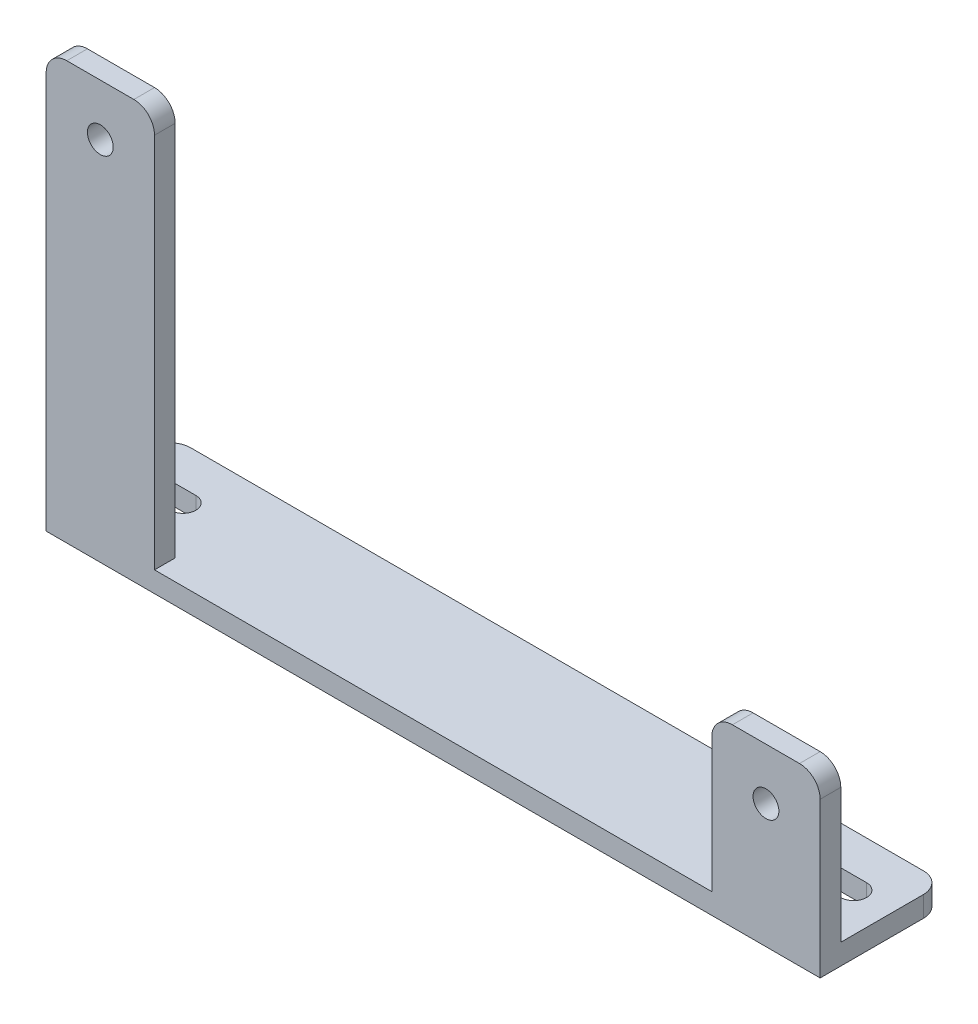
ISO-10303-21;
HEADER;
FILE_DESCRIPTION(('STEP AP214'),'2;1');
FILE_NAME('part.step','',(''),(''),'','','');
FILE_SCHEMA(('AUTOMOTIVE_DESIGN { 1 0 10303 214 1 1 1 1 }'));
ENDSEC;
DATA;
#1=APPLICATION_CONTEXT('core data for automotive mechanical design processes');
#2=APPLICATION_PROTOCOL_DEFINITION('international standard','automotive_design',2000,#1);
#3=PRODUCT_CONTEXT('',#1,'mechanical');
#4=PRODUCT('Part','Part','',(#3));
#5=PRODUCT_RELATED_PRODUCT_CATEGORY('part','',(#4));
#6=PRODUCT_DEFINITION_FORMATION('','',#4);
#7=PRODUCT_DEFINITION_CONTEXT('part definition',#1,'design');
#8=PRODUCT_DEFINITION('design','',#6,#7);
#9=PRODUCT_DEFINITION_SHAPE('','',#8);
#10=(LENGTH_UNIT() NAMED_UNIT(*) SI_UNIT(.MILLI.,.METRE.));
#11=(NAMED_UNIT(*) PLANE_ANGLE_UNIT() SI_UNIT($,.RADIAN.));
#12=(NAMED_UNIT(*) SI_UNIT($,.STERADIAN.) SOLID_ANGLE_UNIT());
#13=UNCERTAINTY_MEASURE_WITH_UNIT(LENGTH_MEASURE(1.E-05),#10,'distance_accuracy_value','');
#14=(GEOMETRIC_REPRESENTATION_CONTEXT(3) GLOBAL_UNCERTAINTY_ASSIGNED_CONTEXT((#13)) GLOBAL_UNIT_ASSIGNED_CONTEXT((#10,
#11,#12)) REPRESENTATION_CONTEXT('',''));
#15=CARTESIAN_POINT('',(0.,0.,0.));
#16=DIRECTION('',(0.,0.,1.));
#17=DIRECTION('',(1.,0.,0.));
#18=AXIS2_PLACEMENT_3D('',#15,#16,#17);
#19=CARTESIAN_POINT('',(0.,4.,0.));
#20=DIRECTION('',(0.,1.,0.));
#21=DIRECTION('',(0.,0.,1.));
#22=AXIS2_PLACEMENT_3D('',#19,#20,#21);
#23=PLANE('',#22);
#24=DIRECTION('',(-1.,0.,0.));
#25=VECTOR('',#24,1.);
#26=CARTESIAN_POINT('',(-75.,4.,-10.));
#27=LINE('',#26,#25);
#28=CARTESIAN_POINT('',(71.,4.,-10.));
#29=VERTEX_POINT('',#28);
#30=CARTESIAN_POINT('',(-71.,4.,-10.));
#31=VERTEX_POINT('',#30);
#32=EDGE_CURVE('E393',#29,#31,#27,.T.);
#33=ORIENTED_EDGE('',*,*,#32,.T.);
#34=CARTESIAN_POINT('',(-71.,4.,-6.));
#35=DIRECTION('',(0.,1.,0.));
#36=DIRECTION('',(0.,0.,1.));
#37=AXIS2_PLACEMENT_3D('',#34,#35,#36);
#38=CIRCLE('',#37,4.);
#39=CARTESIAN_POINT('',(-75.,4.,-6.));
#40=VERTEX_POINT('',#39);
#41=EDGE_CURVE('E458',#31,#40,#38,.T.);
#42=ORIENTED_EDGE('',*,*,#41,.T.);
#43=DIRECTION('',(0.,0.,1.));
#44=VECTOR('',#43,1.);
#45=CARTESIAN_POINT('',(-75.,4.,-10.));
#46=LINE('',#45,#44);
#47=CARTESIAN_POINT('',(-75.,4.,10.));
#48=VERTEX_POINT('',#47);
#49=EDGE_CURVE('E397',#40,#48,#46,.T.);
#50=ORIENTED_EDGE('',*,*,#49,.T.);
#51=DIRECTION('',(1.,0.,0.));
#52=VECTOR('',#51,1.);
#53=CARTESIAN_POINT('',(-75.,4.,10.));
#54=LINE('',#53,#52);
#55=CARTESIAN_POINT('',(-54.,4.,10.));
#56=VERTEX_POINT('',#55);
#57=EDGE_CURVE('E401',#48,#56,#54,.T.);
#58=ORIENTED_EDGE('',*,*,#57,.T.);
#59=DIRECTION('',(0.,0.,-1.));
#60=VECTOR('',#59,1.);
#61=CARTESIAN_POINT('',(-54.,4.,14.));
#62=LINE('',#61,#60);
#63=CARTESIAN_POINT('',(-54.,4.,14.));
#64=VERTEX_POINT('',#63);
#65=EDGE_CURVE('E268',#64,#56,#62,.T.);
#66=ORIENTED_EDGE('',*,*,#65,.F.);
#67=DIRECTION('',(-1.,0.,0.));
#68=VECTOR('',#67,1.);
#69=CARTESIAN_POINT('',(0.,4.,14.));
#70=LINE('',#69,#68);
#71=CARTESIAN_POINT('',(54.,4.,14.));
#72=VERTEX_POINT('',#71);
#73=EDGE_CURVE('E253',#72,#64,#70,.T.);
#74=ORIENTED_EDGE('',*,*,#73,.F.);
#75=DIRECTION('',(0.,0.,-1.));
#76=VECTOR('',#75,1.);
#77=CARTESIAN_POINT('',(54.,4.,14.));
#78=LINE('',#77,#76);
#79=CARTESIAN_POINT('',(54.,4.,10.));
#80=VERTEX_POINT('',#79);
#81=EDGE_CURVE('E300',#72,#80,#78,.T.);
#82=ORIENTED_EDGE('',*,*,#81,.T.);
#83=CARTESIAN_POINT('',(75.,4.,10.));
#84=VERTEX_POINT('',#83);
#85=EDGE_CURVE('E400',#80,#84,#54,.T.);
#86=ORIENTED_EDGE('',*,*,#85,.T.);
#87=DIRECTION('',(0.,0.,-1.));
#88=VECTOR('',#87,1.);
#89=CARTESIAN_POINT('',(75.,4.,-10.));
#90=LINE('',#89,#88);
#91=CARTESIAN_POINT('',(75.,4.,-6.));
#92=VERTEX_POINT('',#91);
#93=EDGE_CURVE('E214',#84,#92,#90,.T.);
#94=ORIENTED_EDGE('',*,*,#93,.T.);
#95=CARTESIAN_POINT('',(71.,4.,-6.));
#96=DIRECTION('',(0.,1.,0.));
#97=DIRECTION('',(0.,0.,1.));
#98=AXIS2_PLACEMENT_3D('',#95,#96,#97);
#99=CIRCLE('',#98,4.);
#100=EDGE_CURVE('E455',#92,#29,#99,.T.);
#101=ORIENTED_EDGE('',*,*,#100,.T.);
#102=EDGE_LOOP('',(#33,#42,#50,#58,#66,#74,#82,#86,#94,#101));
#103=FACE_BOUND('',#102,.T.);
#104=DIRECTION('',(1.,0.,0.));
#105=VECTOR('',#104,1.);
#106=CARTESIAN_POINT('',(-67.5,4.,2.5));
#107=LINE('',#106,#105);
#108=CARTESIAN_POINT('',(-67.5,4.,2.5));
#109=VERTEX_POINT('',#108);
#110=CARTESIAN_POINT('',(-62.5,4.,2.5));
#111=VERTEX_POINT('',#110);
#112=EDGE_CURVE('E351',#109,#111,#107,.T.);
#113=ORIENTED_EDGE('',*,*,#112,.F.);
#114=CARTESIAN_POINT('',(-67.5,4.,0.));
#115=DIRECTION('',(0.,1.,0.));
#116=DIRECTION('',(0.,0.,1.));
#117=AXIS2_PLACEMENT_3D('',#114,#115,#116);
#118=CIRCLE('',#117,2.5);
#119=CARTESIAN_POINT('',(-67.5,4.,-2.5));
#120=VERTEX_POINT('',#119);
#121=EDGE_CURVE('E348',#120,#109,#118,.T.);
#122=ORIENTED_EDGE('',*,*,#121,.F.);
#123=DIRECTION('',(-1.,0.,0.));
#124=VECTOR('',#123,1.);
#125=CARTESIAN_POINT('',(-67.5,4.,-2.5));
#126=LINE('',#125,#124);
#127=CARTESIAN_POINT('',(-62.5,4.,-2.5));
#128=VERTEX_POINT('',#127);
#129=EDGE_CURVE('E359',#128,#120,#126,.T.);
#130=ORIENTED_EDGE('',*,*,#129,.F.);
#131=CARTESIAN_POINT('',(-62.5,4.,0.));
#132=DIRECTION('',(0.,1.,0.));
#133=DIRECTION('',(0.,0.,1.));
#134=AXIS2_PLACEMENT_3D('',#131,#132,#133);
#135=CIRCLE('',#134,2.5);
#136=EDGE_CURVE('E355',#111,#128,#135,.T.);
#137=ORIENTED_EDGE('',*,*,#136,.F.);
#138=EDGE_LOOP('',(#113,#122,#130,#137));
#139=FACE_BOUND('',#138,.T.);
#140=DIRECTION('',(1.,0.,0.));
#141=VECTOR('',#140,1.);
#142=CARTESIAN_POINT('',(62.5,4.,2.5));
#143=LINE('',#142,#141);
#144=CARTESIAN_POINT('',(62.5,4.,2.5));
#145=VERTEX_POINT('',#144);
#146=CARTESIAN_POINT('',(67.5,4.,2.5));
#147=VERTEX_POINT('',#146);
#148=EDGE_CURVE('E308',#145,#147,#143,.T.);
#149=ORIENTED_EDGE('',*,*,#148,.F.);
#150=CARTESIAN_POINT('',(62.5,4.,0.));
#151=DIRECTION('',(0.,1.,0.));
#152=DIRECTION('',(0.,0.,1.));
#153=AXIS2_PLACEMENT_3D('',#150,#151,#152);
#154=CIRCLE('',#153,2.5);
#155=CARTESIAN_POINT('',(62.5,4.,-2.5));
#156=VERTEX_POINT('',#155);
#157=EDGE_CURVE('E305',#156,#145,#154,.T.);
#158=ORIENTED_EDGE('',*,*,#157,.F.);
#159=DIRECTION('',(-1.,0.,0.));
#160=VECTOR('',#159,1.);
#161=CARTESIAN_POINT('',(62.5,4.,-2.5));
#162=LINE('',#161,#160);
#163=CARTESIAN_POINT('',(67.5,4.,-2.5));
#164=VERTEX_POINT('',#163);
#165=EDGE_CURVE('E316',#164,#156,#162,.T.);
#166=ORIENTED_EDGE('',*,*,#165,.F.);
#167=CARTESIAN_POINT('',(67.5,4.,0.));
#168=DIRECTION('',(0.,1.,0.));
#169=DIRECTION('',(0.,0.,1.));
#170=AXIS2_PLACEMENT_3D('',#167,#168,#169);
#171=CIRCLE('',#170,2.5);
#172=EDGE_CURVE('E312',#147,#164,#171,.T.);
#173=ORIENTED_EDGE('',*,*,#172,.F.);
#174=EDGE_LOOP('',(#149,#158,#166,#173));
#175=FACE_BOUND('',#174,.T.);
#176=ADVANCED_FACE('F41',(#103,#139,#175),#23,.T.);
#177=CARTESIAN_POINT('',(0.,0.,0.));
#178=DIRECTION('',(0.,1.,0.));
#179=DIRECTION('',(0.,0.,1.));
#180=AXIS2_PLACEMENT_3D('',#177,#178,#179);
#181=PLANE('',#180);
#182=CARTESIAN_POINT('',(-67.5,0.,0.));
#183=DIRECTION('',(0.,1.,0.));
#184=DIRECTION('',(0.,0.,1.));
#185=AXIS2_PLACEMENT_3D('',#182,#183,#184);
#186=CIRCLE('',#185,2.5);
#187=CARTESIAN_POINT('',(-67.5,0.,-2.5));
#188=VERTEX_POINT('',#187);
#189=CARTESIAN_POINT('',(-67.5,0.,2.5));
#190=VERTEX_POINT('',#189);
#191=EDGE_CURVE('E347',#188,#190,#186,.T.);
#192=ORIENTED_EDGE('',*,*,#191,.T.);
#193=DIRECTION('',(1.,0.,0.));
#194=VECTOR('',#193,1.);
#195=CARTESIAN_POINT('',(-67.5,0.,2.5));
#196=LINE('',#195,#194);
#197=CARTESIAN_POINT('',(-62.5,0.,2.5));
#198=VERTEX_POINT('',#197);
#199=EDGE_CURVE('E366',#190,#198,#196,.T.);
#200=ORIENTED_EDGE('',*,*,#199,.T.);
#201=CARTESIAN_POINT('',(-62.5,0.,0.));
#202=DIRECTION('',(0.,1.,0.));
#203=DIRECTION('',(0.,0.,1.));
#204=AXIS2_PLACEMENT_3D('',#201,#202,#203);
#205=CIRCLE('',#204,2.5);
#206=CARTESIAN_POINT('',(-62.5,0.,-2.5));
#207=VERTEX_POINT('',#206);
#208=EDGE_CURVE('E370',#198,#207,#205,.T.);
#209=ORIENTED_EDGE('',*,*,#208,.T.);
#210=DIRECTION('',(-1.,0.,0.));
#211=VECTOR('',#210,1.);
#212=CARTESIAN_POINT('',(-67.5,0.,-2.5));
#213=LINE('',#212,#211);
#214=EDGE_CURVE('E352',#207,#188,#213,.T.);
#215=ORIENTED_EDGE('',*,*,#214,.T.);
#216=EDGE_LOOP('',(#192,#200,#209,#215));
#217=FACE_BOUND('',#216,.T.);
#218=DIRECTION('',(0.,0.,1.));
#219=VECTOR('',#218,1.);
#220=CARTESIAN_POINT('',(-75.,0.,-10.));
#221=LINE('',#220,#219);
#222=CARTESIAN_POINT('',(-75.,0.,-6.));
#223=VERTEX_POINT('',#222);
#224=CARTESIAN_POINT('',(-75.,0.,14.));
#225=VERTEX_POINT('',#224);
#226=EDGE_CURVE('E202',#223,#225,#221,.T.);
#227=ORIENTED_EDGE('',*,*,#226,.F.);
#228=CARTESIAN_POINT('',(-71.,0.,-6.));
#229=DIRECTION('',(0.,1.,0.));
#230=DIRECTION('',(0.,0.,1.));
#231=AXIS2_PLACEMENT_3D('',#228,#229,#230);
#232=CIRCLE('',#231,4.);
#233=CARTESIAN_POINT('',(-71.,0.,-10.));
#234=VERTEX_POINT('',#233);
#235=EDGE_CURVE('E445',#223,#234,#232,.F.);
#236=ORIENTED_EDGE('',*,*,#235,.T.);
#237=DIRECTION('',(-1.,0.,0.));
#238=VECTOR('',#237,1.);
#239=CARTESIAN_POINT('',(-75.,0.,-10.));
#240=LINE('',#239,#238);
#241=CARTESIAN_POINT('',(71.,0.,-10.));
#242=VERTEX_POINT('',#241);
#243=EDGE_CURVE('E215',#242,#234,#240,.T.);
#244=ORIENTED_EDGE('',*,*,#243,.F.);
#245=CARTESIAN_POINT('',(71.,0.,-6.));
#246=DIRECTION('',(0.,1.,0.));
#247=DIRECTION('',(0.,0.,1.));
#248=AXIS2_PLACEMENT_3D('',#245,#246,#247);
#249=CIRCLE('',#248,4.);
#250=CARTESIAN_POINT('',(75.,0.,-6.));
#251=VERTEX_POINT('',#250);
#252=EDGE_CURVE('E442',#242,#251,#249,.F.);
#253=ORIENTED_EDGE('',*,*,#252,.T.);
#254=DIRECTION('',(0.,0.,-1.));
#255=VECTOR('',#254,1.);
#256=CARTESIAN_POINT('',(75.,0.,-10.));
#257=LINE('',#256,#255);
#258=CARTESIAN_POINT('',(75.,0.,14.));
#259=VERTEX_POINT('',#258);
#260=EDGE_CURVE('E222',#259,#251,#257,.T.);
#261=ORIENTED_EDGE('',*,*,#260,.F.);
#262=DIRECTION('',(1.,0.,0.));
#263=VECTOR('',#262,1.);
#264=CARTESIAN_POINT('',(0.,0.,14.));
#265=LINE('',#264,#263);
#266=EDGE_CURVE('E218',#225,#259,#265,.T.);
#267=ORIENTED_EDGE('',*,*,#266,.F.);
#268=EDGE_LOOP('',(#227,#236,#244,#253,#261,#267));
#269=FACE_BOUND('',#268,.T.);
#270=CARTESIAN_POINT('',(62.5,0.,0.));
#271=DIRECTION('',(0.,1.,0.));
#272=DIRECTION('',(0.,0.,1.));
#273=AXIS2_PLACEMENT_3D('',#270,#271,#272);
#274=CIRCLE('',#273,2.5);
#275=CARTESIAN_POINT('',(62.5,0.,-2.5));
#276=VERTEX_POINT('',#275);
#277=CARTESIAN_POINT('',(62.5,0.,2.5));
#278=VERTEX_POINT('',#277);
#279=EDGE_CURVE('E304',#276,#278,#274,.T.);
#280=ORIENTED_EDGE('',*,*,#279,.T.);
#281=DIRECTION('',(1.,0.,0.));
#282=VECTOR('',#281,1.);
#283=CARTESIAN_POINT('',(62.5,0.,2.5));
#284=LINE('',#283,#282);
#285=CARTESIAN_POINT('',(67.5,0.,2.5));
#286=VERTEX_POINT('',#285);
#287=EDGE_CURVE('E323',#278,#286,#284,.T.);
#288=ORIENTED_EDGE('',*,*,#287,.T.);
#289=CARTESIAN_POINT('',(67.5,0.,0.));
#290=DIRECTION('',(0.,1.,0.));
#291=DIRECTION('',(0.,0.,1.));
#292=AXIS2_PLACEMENT_3D('',#289,#290,#291);
#293=CIRCLE('',#292,2.5);
#294=CARTESIAN_POINT('',(67.5,0.,-2.5));
#295=VERTEX_POINT('',#294);
#296=EDGE_CURVE('E327',#286,#295,#293,.T.);
#297=ORIENTED_EDGE('',*,*,#296,.T.);
#298=DIRECTION('',(-1.,0.,0.));
#299=VECTOR('',#298,1.);
#300=CARTESIAN_POINT('',(62.5,0.,-2.5));
#301=LINE('',#300,#299);
#302=EDGE_CURVE('E309',#295,#276,#301,.T.);
#303=ORIENTED_EDGE('',*,*,#302,.T.);
#304=EDGE_LOOP('',(#280,#288,#297,#303));
#305=FACE_BOUND('',#304,.T.);
#306=ADVANCED_FACE('F219',(#217,#269,#305),#181,.F.);
#307=CARTESIAN_POINT('',(75.,4.,-10.));
#308=DIRECTION('',(-1.,0.,0.));
#309=DIRECTION('',(0.,0.,1.));
#310=AXIS2_PLACEMENT_3D('',#307,#308,#309);
#311=PLANE('',#310);
#312=DIRECTION('',(0.,1.,0.));
#313=VECTOR('',#312,1.);
#314=CARTESIAN_POINT('',(75.,0.,10.));
#315=LINE('',#314,#313);
#316=CARTESIAN_POINT('',(75.,30.,10.));
#317=VERTEX_POINT('',#316);
#318=EDGE_CURVE('E277',#84,#317,#315,.T.);
#319=ORIENTED_EDGE('',*,*,#318,.T.);
#320=DIRECTION('',(0.,0.,-1.));
#321=VECTOR('',#320,1.);
#322=CARTESIAN_POINT('',(75.,30.,-10.));
#323=LINE('',#322,#321);
#324=CARTESIAN_POINT('',(75.,30.,14.));
#325=VERTEX_POINT('',#324);
#326=EDGE_CURVE('E11',#317,#325,#323,.F.);
#327=ORIENTED_EDGE('',*,*,#326,.T.);
#328=DIRECTION('',(0.,1.,0.));
#329=VECTOR('',#328,1.);
#330=CARTESIAN_POINT('',(75.,0.,14.));
#331=LINE('',#330,#329);
#332=EDGE_CURVE('E227',#259,#325,#331,.T.);
#333=ORIENTED_EDGE('',*,*,#332,.F.);
#334=ORIENTED_EDGE('',*,*,#260,.T.);
#335=DIRECTION('',(0.,-1.,0.));
#336=VECTOR('',#335,1.);
#337=CARTESIAN_POINT('',(75.,4.,-6.));
#338=LINE('',#337,#336);
#339=EDGE_CURVE('E50',#251,#92,#338,.F.);
#340=ORIENTED_EDGE('',*,*,#339,.T.);
#341=ORIENTED_EDGE('',*,*,#93,.F.);
#342=EDGE_LOOP('',(#319,#327,#333,#334,#340,#341));
#343=FACE_BOUND('',#342,.T.);
#344=ADVANCED_FACE('F479',(#343),#311,.F.);
#345=CARTESIAN_POINT('',(-75.,4.,-10.));
#346=DIRECTION('',(0.,0.,1.));
#347=DIRECTION('',(1.,0.,0.));
#348=AXIS2_PLACEMENT_3D('',#345,#346,#347);
#349=PLANE('',#348);
#350=ORIENTED_EDGE('',*,*,#243,.T.);
#351=DIRECTION('',(0.,-1.,0.));
#352=VECTOR('',#351,1.);
#353=CARTESIAN_POINT('',(-71.,4.,-10.));
#354=LINE('',#353,#352);
#355=EDGE_CURVE('E452',#234,#31,#354,.F.);
#356=ORIENTED_EDGE('',*,*,#355,.T.);
#357=ORIENTED_EDGE('',*,*,#32,.F.);
#358=DIRECTION('',(0.,-1.,0.));
#359=VECTOR('',#358,1.);
#360=CARTESIAN_POINT('',(71.,4.,-10.));
#361=LINE('',#360,#359);
#362=EDGE_CURVE('E448',#29,#242,#361,.T.);
#363=ORIENTED_EDGE('',*,*,#362,.T.);
#364=EDGE_LOOP('',(#350,#356,#357,#363));
#365=FACE_BOUND('',#364,.T.);
#366=ADVANCED_FACE('F489',(#365),#349,.F.);
#367=CARTESIAN_POINT('',(-75.,4.,-10.));
#368=DIRECTION('',(1.,0.,0.));
#369=DIRECTION('',(0.,0.,-1.));
#370=AXIS2_PLACEMENT_3D('',#367,#368,#369);
#371=PLANE('',#370);
#372=DIRECTION('',(0.,1.,0.));
#373=VECTOR('',#372,1.);
#374=CARTESIAN_POINT('',(-75.,0.,14.));
#375=LINE('',#374,#373);
#376=CARTESIAN_POINT('',(-75.,76.9521602203402,14.));
#377=VERTEX_POINT('',#376);
#378=EDGE_CURVE('E207',#225,#377,#375,.T.);
#379=ORIENTED_EDGE('',*,*,#378,.T.);
#380=DIRECTION('',(0.,0.,-1.));
#381=VECTOR('',#380,1.);
#382=CARTESIAN_POINT('',(-75.,76.9521602203402,10.));
#383=LINE('',#382,#381);
#384=CARTESIAN_POINT('',(-75.,76.9521602203402,10.));
#385=VERTEX_POINT('',#384);
#386=EDGE_CURVE('E439',#377,#385,#383,.T.);
#387=ORIENTED_EDGE('',*,*,#386,.T.);
#388=DIRECTION('',(0.,1.,0.));
#389=VECTOR('',#388,1.);
#390=CARTESIAN_POINT('',(-75.,0.,10.));
#391=LINE('',#390,#389);
#392=EDGE_CURVE('E273',#48,#385,#391,.T.);
#393=ORIENTED_EDGE('',*,*,#392,.F.);
#394=ORIENTED_EDGE('',*,*,#49,.F.);
#395=DIRECTION('',(0.,-1.,0.));
#396=VECTOR('',#395,1.);
#397=CARTESIAN_POINT('',(-75.,4.,-6.));
#398=LINE('',#397,#396);
#399=EDGE_CURVE('E211',#40,#223,#398,.T.);
#400=ORIENTED_EDGE('',*,*,#399,.T.);
#401=ORIENTED_EDGE('',*,*,#226,.T.);
#402=EDGE_LOOP('',(#379,#387,#393,#394,#400,#401));
#403=FACE_BOUND('',#402,.T.);
#404=ADVANCED_FACE('F204',(#403),#371,.F.);
#405=CARTESIAN_POINT('',(-67.5,4.,0.));
#406=DIRECTION('',(0.,-1.,0.));
#407=DIRECTION('',(0.,0.,-1.));
#408=AXIS2_PLACEMENT_3D('',#405,#406,#407);
#409=CYLINDRICAL_SURFACE('',#408,2.5);
#410=ORIENTED_EDGE('',*,*,#191,.F.);
#411=DIRECTION('',(0.,-1.,0.));
#412=VECTOR('',#411,1.);
#413=CARTESIAN_POINT('',(-67.5,4.,-2.5));
#414=LINE('',#413,#412);
#415=EDGE_CURVE('E362',#120,#188,#414,.T.);
#416=ORIENTED_EDGE('',*,*,#415,.F.);
#417=ORIENTED_EDGE('',*,*,#121,.T.);
#418=DIRECTION('',(0.,-1.,0.));
#419=VECTOR('',#418,1.);
#420=CARTESIAN_POINT('',(-67.5,4.,2.5));
#421=LINE('',#420,#419);
#422=EDGE_CURVE('E386',#109,#190,#421,.T.);
#423=ORIENTED_EDGE('',*,*,#422,.T.);
#424=EDGE_LOOP('',(#410,#416,#417,#423));
#425=FACE_BOUND('',#424,.T.);
#426=ADVANCED_FACE('F553',(#425),#409,.F.);
#427=CARTESIAN_POINT('',(-67.5,4.,2.5));
#428=DIRECTION('',(0.,0.,-1.));
#429=DIRECTION('',(-1.,0.,0.));
#430=AXIS2_PLACEMENT_3D('',#427,#428,#429);
#431=PLANE('',#430);
#432=ORIENTED_EDGE('',*,*,#199,.F.);
#433=ORIENTED_EDGE('',*,*,#422,.F.);
#434=ORIENTED_EDGE('',*,*,#112,.T.);
#435=DIRECTION('',(0.,-1.,0.));
#436=VECTOR('',#435,1.);
#437=CARTESIAN_POINT('',(-62.5,4.,2.5));
#438=LINE('',#437,#436);
#439=EDGE_CURVE('E383',#111,#198,#438,.T.);
#440=ORIENTED_EDGE('',*,*,#439,.T.);
#441=EDGE_LOOP('',(#432,#433,#434,#440));
#442=FACE_BOUND('',#441,.T.);
#443=ADVANCED_FACE('F771',(#442),#431,.T.);
#444=CARTESIAN_POINT('',(-62.5,4.,0.));
#445=DIRECTION('',(0.,-1.,0.));
#446=DIRECTION('',(0.,0.,-1.));
#447=AXIS2_PLACEMENT_3D('',#444,#445,#446);
#448=CYLINDRICAL_SURFACE('',#447,2.5);
#449=ORIENTED_EDGE('',*,*,#208,.F.);
#450=ORIENTED_EDGE('',*,*,#439,.F.);
#451=ORIENTED_EDGE('',*,*,#136,.T.);
#452=DIRECTION('',(0.,-1.,0.));
#453=VECTOR('',#452,1.);
#454=CARTESIAN_POINT('',(-62.5,4.,-2.5));
#455=LINE('',#454,#453);
#456=EDGE_CURVE('E380',#128,#207,#455,.T.);
#457=ORIENTED_EDGE('',*,*,#456,.T.);
#458=EDGE_LOOP('',(#449,#450,#451,#457));
#459=FACE_BOUND('',#458,.T.);
#460=ADVANCED_FACE('F761',(#459),#448,.F.);
#461=CARTESIAN_POINT('',(-67.5,4.,-2.5));
#462=DIRECTION('',(0.,0.,1.));
#463=DIRECTION('',(1.,0.,0.));
#464=AXIS2_PLACEMENT_3D('',#461,#462,#463);
#465=PLANE('',#464);
#466=ORIENTED_EDGE('',*,*,#214,.F.);
#467=ORIENTED_EDGE('',*,*,#456,.F.);
#468=ORIENTED_EDGE('',*,*,#129,.T.);
#469=ORIENTED_EDGE('',*,*,#415,.T.);
#470=EDGE_LOOP('',(#466,#467,#468,#469));
#471=FACE_BOUND('',#470,.T.);
#472=ADVANCED_FACE('F751',(#471),#465,.T.);
#473=CARTESIAN_POINT('',(62.5,4.,0.));
#474=DIRECTION('',(0.,-1.,0.));
#475=DIRECTION('',(0.,0.,-1.));
#476=AXIS2_PLACEMENT_3D('',#473,#474,#475);
#477=CYLINDRICAL_SURFACE('',#476,2.5);
#478=ORIENTED_EDGE('',*,*,#279,.F.);
#479=DIRECTION('',(0.,-1.,0.));
#480=VECTOR('',#479,1.);
#481=CARTESIAN_POINT('',(62.5,4.,-2.5));
#482=LINE('',#481,#480);
#483=EDGE_CURVE('E319',#156,#276,#482,.T.);
#484=ORIENTED_EDGE('',*,*,#483,.F.);
#485=ORIENTED_EDGE('',*,*,#157,.T.);
#486=DIRECTION('',(0.,-1.,0.));
#487=VECTOR('',#486,1.);
#488=CARTESIAN_POINT('',(62.5,4.,2.5));
#489=LINE('',#488,#487);
#490=EDGE_CURVE('E343',#145,#278,#489,.T.);
#491=ORIENTED_EDGE('',*,*,#490,.T.);
#492=EDGE_LOOP('',(#478,#484,#485,#491));
#493=FACE_BOUND('',#492,.T.);
#494=ADVANCED_FACE('F741',(#493),#477,.F.);
#495=CARTESIAN_POINT('',(62.5,4.,2.5));
#496=DIRECTION('',(0.,0.,-1.));
#497=DIRECTION('',(-1.,0.,0.));
#498=AXIS2_PLACEMENT_3D('',#495,#496,#497);
#499=PLANE('',#498);
#500=ORIENTED_EDGE('',*,*,#287,.F.);
#501=ORIENTED_EDGE('',*,*,#490,.F.);
#502=ORIENTED_EDGE('',*,*,#148,.T.);
#503=DIRECTION('',(0.,-1.,0.));
#504=VECTOR('',#503,1.);
#505=CARTESIAN_POINT('',(67.5,4.,2.5));
#506=LINE('',#505,#504);
#507=EDGE_CURVE('E340',#147,#286,#506,.T.);
#508=ORIENTED_EDGE('',*,*,#507,.T.);
#509=EDGE_LOOP('',(#500,#501,#502,#508));
#510=FACE_BOUND('',#509,.T.);
#511=ADVANCED_FACE('F731',(#510),#499,.T.);
#512=CARTESIAN_POINT('',(67.5,4.,0.));
#513=DIRECTION('',(0.,-1.,0.));
#514=DIRECTION('',(0.,0.,-1.));
#515=AXIS2_PLACEMENT_3D('',#512,#513,#514);
#516=CYLINDRICAL_SURFACE('',#515,2.5);
#517=ORIENTED_EDGE('',*,*,#296,.F.);
#518=ORIENTED_EDGE('',*,*,#507,.F.);
#519=ORIENTED_EDGE('',*,*,#172,.T.);
#520=DIRECTION('',(0.,-1.,0.));
#521=VECTOR('',#520,1.);
#522=CARTESIAN_POINT('',(67.5,4.,-2.5));
#523=LINE('',#522,#521);
#524=EDGE_CURVE('E337',#164,#295,#523,.T.);
#525=ORIENTED_EDGE('',*,*,#524,.T.);
#526=EDGE_LOOP('',(#517,#518,#519,#525));
#527=FACE_BOUND('',#526,.T.);
#528=ADVANCED_FACE('F721',(#527),#516,.F.);
#529=CARTESIAN_POINT('',(62.5,4.,-2.5));
#530=DIRECTION('',(0.,0.,1.));
#531=DIRECTION('',(1.,0.,0.));
#532=AXIS2_PLACEMENT_3D('',#529,#530,#531);
#533=PLANE('',#532);
#534=ORIENTED_EDGE('',*,*,#302,.F.);
#535=ORIENTED_EDGE('',*,*,#524,.F.);
#536=ORIENTED_EDGE('',*,*,#165,.T.);
#537=ORIENTED_EDGE('',*,*,#483,.T.);
#538=EDGE_LOOP('',(#534,#535,#536,#537));
#539=FACE_BOUND('',#538,.T.);
#540=ADVANCED_FACE('F663',(#539),#533,.T.);
#541=CARTESIAN_POINT('',(0.,0.,10.));
#542=DIRECTION('',(0.,0.,1.));
#543=DIRECTION('',(1.,0.,0.));
#544=AXIS2_PLACEMENT_3D('',#541,#542,#543);
#545=PLANE('',#544);
#546=DIRECTION('',(1.,0.,0.));
#547=VECTOR('',#546,1.);
#548=CARTESIAN_POINT('',(0.,80.9521602203402,10.));
#549=LINE('',#548,#547);
#550=CARTESIAN_POINT('',(-71.,80.9521602203402,10.));
#551=VERTEX_POINT('',#550);
#552=CARTESIAN_POINT('',(-58.,80.9521602203402,10.));
#553=VERTEX_POINT('',#552);
#554=EDGE_CURVE('E290',#551,#553,#549,.T.);
#555=ORIENTED_EDGE('',*,*,#554,.T.);
#556=CARTESIAN_POINT('',(-58.,76.9521602203402,10.));
#557=DIRECTION('',(0.,0.,1.));
#558=DIRECTION('',(1.,0.,0.));
#559=AXIS2_PLACEMENT_3D('',#556,#557,#558);
#560=CIRCLE('',#559,4.);
#561=CARTESIAN_POINT('',(-54.,76.9521602203402,10.));
#562=VERTEX_POINT('',#561);
#563=EDGE_CURVE('E420',#553,#562,#560,.F.);
#564=ORIENTED_EDGE('',*,*,#563,.T.);
#565=DIRECTION('',(0.,1.,0.));
#566=VECTOR('',#565,1.);
#567=CARTESIAN_POINT('',(-54.,0.,10.));
#568=LINE('',#567,#566);
#569=EDGE_CURVE('E286',#56,#562,#568,.T.);
#570=ORIENTED_EDGE('',*,*,#569,.F.);
#571=ORIENTED_EDGE('',*,*,#57,.F.);
#572=ORIENTED_EDGE('',*,*,#392,.T.);
#573=CARTESIAN_POINT('',(-71.,76.9521602203402,10.));
#574=DIRECTION('',(0.,0.,1.));
#575=DIRECTION('',(1.,0.,0.));
#576=AXIS2_PLACEMENT_3D('',#573,#574,#575);
#577=CIRCLE('',#576,4.);
#578=EDGE_CURVE('E417',#385,#551,#577,.F.);
#579=ORIENTED_EDGE('',*,*,#578,.T.);
#580=EDGE_LOOP('',(#555,#564,#570,#571,#572,#579));
#581=FACE_BOUND('',#580,.T.);
#582=CARTESIAN_POINT('',(-64.5,70.9521602203402,10.));
#583=DIRECTION('',(0.,0.,1.));
#584=DIRECTION('',(1.,0.,0.));
#585=AXIS2_PLACEMENT_3D('',#582,#583,#584);
#586=CIRCLE('',#585,2.5);
#587=CARTESIAN_POINT('',(-62.,70.9521602203402,10.));
#588=VERTEX_POINT('',#587);
#589=EDGE_CURVE('E269',#588,#588,#586,.T.);
#590=ORIENTED_EDGE('',*,*,#589,.T.);
#591=EDGE_LOOP('',(#590));
#592=FACE_BOUND('',#591,.T.);
#593=ADVANCED_FACE('F497',(#581,#592),#545,.F.);
#594=CARTESIAN_POINT('',(0.,34.,14.));
#595=DIRECTION('',(0.,-1.,0.));
#596=DIRECTION('',(1.,0.,0.));
#597=AXIS2_PLACEMENT_3D('',#594,#595,#596);
#598=PLANE('',#597);
#599=DIRECTION('',(-1.,0.,0.));
#600=VECTOR('',#599,1.);
#601=CARTESIAN_POINT('',(0.,34.,10.));
#602=LINE('',#601,#600);
#603=CARTESIAN_POINT('',(71.,34.,10.));
#604=VERTEX_POINT('',#603);
#605=CARTESIAN_POINT('',(58.,34.,10.));
#606=VERTEX_POINT('',#605);
#607=EDGE_CURVE('E280',#604,#606,#602,.T.);
#608=ORIENTED_EDGE('',*,*,#607,.T.);
#609=DIRECTION('',(0.,0.,-1.));
#610=VECTOR('',#609,1.);
#611=CARTESIAN_POINT('',(58.,34.,14.));
#612=LINE('',#611,#610);
#613=CARTESIAN_POINT('',(58.,34.,14.));
#614=VERTEX_POINT('',#613);
#615=EDGE_CURVE('E473',#606,#614,#612,.F.);
#616=ORIENTED_EDGE('',*,*,#615,.T.);
#617=DIRECTION('',(-1.,0.,0.));
#618=VECTOR('',#617,1.);
#619=CARTESIAN_POINT('',(0.,34.,14.));
#620=LINE('',#619,#618);
#621=CARTESIAN_POINT('',(71.,34.,14.));
#622=VERTEX_POINT('',#621);
#623=EDGE_CURVE('E245',#622,#614,#620,.T.);
#624=ORIENTED_EDGE('',*,*,#623,.F.);
#625=DIRECTION('',(0.,0.,-1.));
#626=VECTOR('',#625,1.);
#627=CARTESIAN_POINT('',(71.,34.,14.));
#628=LINE('',#627,#626);
#629=EDGE_CURVE('E469',#622,#604,#628,.T.);
#630=ORIENTED_EDGE('',*,*,#629,.T.);
#631=EDGE_LOOP('',(#608,#616,#624,#630));
#632=FACE_BOUND('',#631,.T.);
#633=ADVANCED_FACE('F517',(#632),#598,.F.);
#634=CARTESIAN_POINT('',(54.,0.,14.));
#635=DIRECTION('',(-1.,0.,0.));
#636=DIRECTION('',(0.,0.,1.));
#637=AXIS2_PLACEMENT_3D('',#634,#635,#636);
#638=PLANE('',#637);
#639=DIRECTION('',(0.,1.,0.));
#640=VECTOR('',#639,1.);
#641=CARTESIAN_POINT('',(54.,0.,14.));
#642=LINE('',#641,#640);
#643=CARTESIAN_POINT('',(54.,30.,14.));
#644=VERTEX_POINT('',#643);
#645=EDGE_CURVE('E249',#72,#644,#642,.T.);
#646=ORIENTED_EDGE('',*,*,#645,.T.);
#647=DIRECTION('',(0.,0.,-1.));
#648=VECTOR('',#647,1.);
#649=CARTESIAN_POINT('',(54.,30.,10.));
#650=LINE('',#649,#648);
#651=CARTESIAN_POINT('',(54.,30.,10.));
#652=VERTEX_POINT('',#651);
#653=EDGE_CURVE('E461',#644,#652,#650,.T.);
#654=ORIENTED_EDGE('',*,*,#653,.T.);
#655=DIRECTION('',(0.,1.,0.));
#656=VECTOR('',#655,1.);
#657=CARTESIAN_POINT('',(54.,0.,10.));
#658=LINE('',#657,#656);
#659=EDGE_CURVE('E283',#80,#652,#658,.T.);
#660=ORIENTED_EDGE('',*,*,#659,.F.);
#661=ORIENTED_EDGE('',*,*,#81,.F.);
#662=EDGE_LOOP('',(#646,#654,#660,#661));
#663=FACE_BOUND('',#662,.T.);
#664=ADVANCED_FACE('F510',(#663),#638,.T.);
#665=CARTESIAN_POINT('',(-54.,0.,14.));
#666=DIRECTION('',(-1.,0.,0.));
#667=DIRECTION('',(0.,0.,1.));
#668=AXIS2_PLACEMENT_3D('',#665,#666,#667);
#669=PLANE('',#668);
#670=ORIENTED_EDGE('',*,*,#569,.T.);
#671=DIRECTION('',(0.,0.,-1.));
#672=VECTOR('',#671,1.);
#673=CARTESIAN_POINT('',(-54.,76.9521602203402,14.));
#674=LINE('',#673,#672);
#675=CARTESIAN_POINT('',(-54.,76.9521602203402,14.));
#676=VERTEX_POINT('',#675);
#677=EDGE_CURVE('E423',#562,#676,#674,.F.);
#678=ORIENTED_EDGE('',*,*,#677,.T.);
#679=DIRECTION('',(0.,1.,0.));
#680=VECTOR('',#679,1.);
#681=CARTESIAN_POINT('',(-54.,0.,14.));
#682=LINE('',#681,#680);
#683=EDGE_CURVE('E257',#64,#676,#682,.T.);
#684=ORIENTED_EDGE('',*,*,#683,.F.);
#685=ORIENTED_EDGE('',*,*,#65,.T.);
#686=EDGE_LOOP('',(#670,#678,#684,#685));
#687=FACE_BOUND('',#686,.T.);
#688=ADVANCED_FACE('F504',(#687),#669,.F.);
#689=CARTESIAN_POINT('',(0.,80.9521602203402,14.));
#690=DIRECTION('',(0.,1.,0.));
#691=DIRECTION('',(0.,0.,1.));
#692=AXIS2_PLACEMENT_3D('',#689,#690,#691);
#693=PLANE('',#692);
#694=DIRECTION('',(1.,0.,0.));
#695=VECTOR('',#694,1.);
#696=CARTESIAN_POINT('',(0.,80.9521602203402,14.));
#697=LINE('',#696,#695);
#698=CARTESIAN_POINT('',(-71.,80.9521602203402,14.));
#699=VERTEX_POINT('',#698);
#700=CARTESIAN_POINT('',(-58.,80.9521602203402,14.));
#701=VERTEX_POINT('',#700);
#702=EDGE_CURVE('E260',#699,#701,#697,.T.);
#703=ORIENTED_EDGE('',*,*,#702,.T.);
#704=DIRECTION('',(0.,0.,-1.));
#705=VECTOR('',#704,1.);
#706=CARTESIAN_POINT('',(-58.,80.9521602203402,10.));
#707=LINE('',#706,#705);
#708=EDGE_CURVE('E413',#701,#553,#707,.T.);
#709=ORIENTED_EDGE('',*,*,#708,.T.);
#710=ORIENTED_EDGE('',*,*,#554,.F.);
#711=DIRECTION('',(0.,0.,-1.));
#712=VECTOR('',#711,1.);
#713=CARTESIAN_POINT('',(-71.,80.9521602203402,14.));
#714=LINE('',#713,#712);
#715=EDGE_CURVE('E405',#551,#699,#714,.F.);
#716=ORIENTED_EDGE('',*,*,#715,.T.);
#717=EDGE_LOOP('',(#703,#709,#710,#716));
#718=FACE_BOUND('',#717,.T.);
#719=ADVANCED_FACE('F541',(#718),#693,.T.);
#720=CARTESIAN_POINT('',(-64.5,70.9521602203402,14.));
#721=DIRECTION('',(0.,0.,-1.));
#722=DIRECTION('',(-1.,0.,0.));
#723=AXIS2_PLACEMENT_3D('',#720,#721,#722);
#724=CYLINDRICAL_SURFACE('',#723,2.5);
#725=CARTESIAN_POINT('',(-64.5,70.9521602203402,14.));
#726=DIRECTION('',(0.,0.,1.));
#727=DIRECTION('',(1.,0.,0.));
#728=AXIS2_PLACEMENT_3D('',#725,#726,#727);
#729=CIRCLE('',#728,2.5);
#730=CARTESIAN_POINT('',(-62.,70.9521602203402,14.));
#731=VERTEX_POINT('',#730);
#732=EDGE_CURVE('E236',#731,#731,#729,.T.);
#733=ORIENTED_EDGE('',*,*,#732,.T.);
#734=EDGE_LOOP('',(#733));
#735=FACE_BOUND('',#734,.T.);
#736=ORIENTED_EDGE('',*,*,#589,.F.);
#737=EDGE_LOOP('',(#736));
#738=FACE_BOUND('',#737,.T.);
#739=ADVANCED_FACE('F532',(#735,#738),#724,.F.);
#740=CARTESIAN_POINT('',(64.5,24.,14.));
#741=DIRECTION('',(0.,0.,-1.));
#742=DIRECTION('',(-1.,0.,0.));
#743=AXIS2_PLACEMENT_3D('',#740,#741,#742);
#744=CYLINDRICAL_SURFACE('',#743,2.5);
#745=CARTESIAN_POINT('',(64.5,24.,14.));
#746=DIRECTION('',(0.,0.,1.));
#747=DIRECTION('',(1.,0.,0.));
#748=AXIS2_PLACEMENT_3D('',#745,#746,#747);
#749=CIRCLE('',#748,2.5);
#750=CARTESIAN_POINT('',(67.,24.,14.));
#751=VERTEX_POINT('',#750);
#752=EDGE_CURVE('E264',#751,#751,#749,.T.);
#753=ORIENTED_EDGE('',*,*,#752,.T.);
#754=EDGE_LOOP('',(#753));
#755=FACE_BOUND('',#754,.T.);
#756=CARTESIAN_POINT('',(64.5,24.,10.));
#757=DIRECTION('',(0.,0.,1.));
#758=DIRECTION('',(1.,0.,0.));
#759=AXIS2_PLACEMENT_3D('',#756,#757,#758);
#760=CIRCLE('',#759,2.5);
#761=CARTESIAN_POINT('',(67.,24.,10.));
#762=VERTEX_POINT('',#761);
#763=EDGE_CURVE('E240',#762,#762,#760,.T.);
#764=ORIENTED_EDGE('',*,*,#763,.F.);
#765=EDGE_LOOP('',(#764));
#766=FACE_BOUND('',#765,.T.);
#767=ADVANCED_FACE('F530',(#755,#766),#744,.F.);
#768=CARTESIAN_POINT('',(0.,0.,14.));
#769=DIRECTION('',(0.,0.,1.));
#770=DIRECTION('',(1.,0.,0.));
#771=AXIS2_PLACEMENT_3D('',#768,#769,#770);
#772=PLANE('',#771);
#773=ORIENTED_EDGE('',*,*,#732,.F.);
#774=EDGE_LOOP('',(#773));
#775=FACE_BOUND('',#774,.T.);
#776=ORIENTED_EDGE('',*,*,#683,.T.);
#777=CARTESIAN_POINT('',(-58.,76.9521602203402,14.));
#778=DIRECTION('',(0.,0.,1.));
#779=DIRECTION('',(1.,0.,0.));
#780=AXIS2_PLACEMENT_3D('',#777,#778,#779);
#781=CIRCLE('',#780,4.);
#782=EDGE_CURVE('E434',#676,#701,#781,.T.);
#783=ORIENTED_EDGE('',*,*,#782,.T.);
#784=ORIENTED_EDGE('',*,*,#702,.F.);
#785=CARTESIAN_POINT('',(-71.,76.9521602203402,14.));
#786=DIRECTION('',(0.,0.,1.));
#787=DIRECTION('',(1.,0.,0.));
#788=AXIS2_PLACEMENT_3D('',#785,#786,#787);
#789=CIRCLE('',#788,4.);
#790=EDGE_CURVE('E234',#699,#377,#789,.T.);
#791=ORIENTED_EDGE('',*,*,#790,.T.);
#792=ORIENTED_EDGE('',*,*,#378,.F.);
#793=ORIENTED_EDGE('',*,*,#266,.T.);
#794=ORIENTED_EDGE('',*,*,#332,.T.);
#795=CARTESIAN_POINT('',(71.,30.,14.));
#796=DIRECTION('',(0.,0.,1.));
#797=DIRECTION('',(1.,0.,0.));
#798=AXIS2_PLACEMENT_3D('',#795,#796,#797);
#799=CIRCLE('',#798,4.);
#800=EDGE_CURVE('E426',#325,#622,#799,.T.);
#801=ORIENTED_EDGE('',*,*,#800,.T.);
#802=ORIENTED_EDGE('',*,*,#623,.T.);
#803=CARTESIAN_POINT('',(58.,30.,14.));
#804=DIRECTION('',(0.,0.,1.));
#805=DIRECTION('',(1.,0.,0.));
#806=AXIS2_PLACEMENT_3D('',#803,#804,#805);
#807=CIRCLE('',#806,4.);
#808=EDGE_CURVE('E429',#614,#644,#807,.T.);
#809=ORIENTED_EDGE('',*,*,#808,.T.);
#810=ORIENTED_EDGE('',*,*,#645,.F.);
#811=ORIENTED_EDGE('',*,*,#73,.T.);
#812=EDGE_LOOP('',(#776,#783,#784,#791,#792,#793,#794,#801,#802,#809,#810,#811));
#813=FACE_BOUND('',#812,.T.);
#814=ORIENTED_EDGE('',*,*,#752,.F.);
#815=EDGE_LOOP('',(#814));
#816=FACE_BOUND('',#815,.T.);
#817=ADVANCED_FACE('F230',(#775,#813,#816),#772,.T.);
#818=ORIENTED_EDGE('',*,*,#659,.T.);
#819=CARTESIAN_POINT('',(58.,30.,10.));
#820=DIRECTION('',(0.,0.,1.));
#821=DIRECTION('',(1.,0.,0.));
#822=AXIS2_PLACEMENT_3D('',#819,#820,#821);
#823=CIRCLE('',#822,4.);
#824=EDGE_CURVE('E63',#652,#606,#823,.F.);
#825=ORIENTED_EDGE('',*,*,#824,.T.);
#826=ORIENTED_EDGE('',*,*,#607,.F.);
#827=CARTESIAN_POINT('',(71.,30.,10.));
#828=DIRECTION('',(0.,0.,1.));
#829=DIRECTION('',(1.,0.,0.));
#830=AXIS2_PLACEMENT_3D('',#827,#828,#829);
#831=CIRCLE('',#830,4.);
#832=EDGE_CURVE('E57',#604,#317,#831,.F.);
#833=ORIENTED_EDGE('',*,*,#832,.T.);
#834=ORIENTED_EDGE('',*,*,#318,.F.);
#835=ORIENTED_EDGE('',*,*,#85,.F.);
#836=EDGE_LOOP('',(#818,#825,#826,#833,#834,#835));
#837=FACE_BOUND('',#836,.T.);
#838=ORIENTED_EDGE('',*,*,#763,.T.);
#839=EDGE_LOOP('',(#838));
#840=FACE_BOUND('',#839,.T.);
#841=ADVANCED_FACE('F523',(#837,#840),#545,.F.);
#842=CARTESIAN_POINT('',(-58.,76.9521602203402,14.));
#843=DIRECTION('',(0.,0.,1.));
#844=DIRECTION('',(1.,0.,0.));
#845=AXIS2_PLACEMENT_3D('',#842,#843,#844);
#846=CYLINDRICAL_SURFACE('',#845,4.);
#847=ORIENTED_EDGE('',*,*,#782,.F.);
#848=ORIENTED_EDGE('',*,*,#677,.F.);
#849=ORIENTED_EDGE('',*,*,#563,.F.);
#850=ORIENTED_EDGE('',*,*,#708,.F.);
#851=EDGE_LOOP('',(#847,#848,#849,#850));
#852=FACE_BOUND('',#851,.T.);
#853=ADVANCED_FACE('F526',(#852),#846,.T.);
#854=CARTESIAN_POINT('',(-71.,76.9521602203402,-10.));
#855=DIRECTION('',(0.,0.,1.));
#856=DIRECTION('',(1.,0.,0.));
#857=AXIS2_PLACEMENT_3D('',#854,#855,#856);
#858=CYLINDRICAL_SURFACE('',#857,4.);
#859=ORIENTED_EDGE('',*,*,#790,.F.);
#860=ORIENTED_EDGE('',*,*,#715,.F.);
#861=ORIENTED_EDGE('',*,*,#578,.F.);
#862=ORIENTED_EDGE('',*,*,#386,.F.);
#863=EDGE_LOOP('',(#859,#860,#861,#862));
#864=FACE_BOUND('',#863,.T.);
#865=ADVANCED_FACE('F564',(#864),#858,.T.);
#866=CARTESIAN_POINT('',(-71.,4.,-6.));
#867=DIRECTION('',(0.,-1.,0.));
#868=DIRECTION('',(0.,0.,-1.));
#869=AXIS2_PLACEMENT_3D('',#866,#867,#868);
#870=CYLINDRICAL_SURFACE('',#869,4.);
#871=ORIENTED_EDGE('',*,*,#41,.F.);
#872=ORIENTED_EDGE('',*,*,#355,.F.);
#873=ORIENTED_EDGE('',*,*,#235,.F.);
#874=ORIENTED_EDGE('',*,*,#399,.F.);
#875=EDGE_LOOP('',(#871,#872,#873,#874));
#876=FACE_BOUND('',#875,.T.);
#877=ADVANCED_FACE('F493',(#876),#870,.T.);
#878=CARTESIAN_POINT('',(58.,30.,14.));
#879=DIRECTION('',(0.,0.,1.));
#880=DIRECTION('',(1.,0.,0.));
#881=AXIS2_PLACEMENT_3D('',#878,#879,#880);
#882=CYLINDRICAL_SURFACE('',#881,4.);
#883=ORIENTED_EDGE('',*,*,#808,.F.);
#884=ORIENTED_EDGE('',*,*,#615,.F.);
#885=ORIENTED_EDGE('',*,*,#824,.F.);
#886=ORIENTED_EDGE('',*,*,#653,.F.);
#887=EDGE_LOOP('',(#883,#884,#885,#886));
#888=FACE_BOUND('',#887,.T.);
#889=ADVANCED_FACE('F513',(#888),#882,.T.);
#890=CARTESIAN_POINT('',(71.,30.,14.));
#891=DIRECTION('',(0.,0.,-1.));
#892=DIRECTION('',(-1.,0.,0.));
#893=AXIS2_PLACEMENT_3D('',#890,#891,#892);
#894=CYLINDRICAL_SURFACE('',#893,4.);
#895=ORIENTED_EDGE('',*,*,#800,.F.);
#896=ORIENTED_EDGE('',*,*,#326,.F.);
#897=ORIENTED_EDGE('',*,*,#832,.F.);
#898=ORIENTED_EDGE('',*,*,#629,.F.);
#899=EDGE_LOOP('',(#895,#896,#897,#898));
#900=FACE_BOUND('',#899,.T.);
#901=ADVANCED_FACE('F522',(#900),#894,.T.);
#902=CARTESIAN_POINT('',(71.,4.,-6.));
#903=DIRECTION('',(0.,-1.,0.));
#904=DIRECTION('',(0.,0.,-1.));
#905=AXIS2_PLACEMENT_3D('',#902,#903,#904);
#906=CYLINDRICAL_SURFACE('',#905,4.);
#907=ORIENTED_EDGE('',*,*,#100,.F.);
#908=ORIENTED_EDGE('',*,*,#339,.F.);
#909=ORIENTED_EDGE('',*,*,#252,.F.);
#910=ORIENTED_EDGE('',*,*,#362,.F.);
#911=EDGE_LOOP('',(#907,#908,#909,#910));
#912=FACE_BOUND('',#911,.T.);
#913=ADVANCED_FACE('F43',(#912),#906,.T.);
#914=CLOSED_SHELL('',(#176,#306,#344,#366,#404,#426,#443,#460,#472,#494,#511,#528,#540,#593,
#633,#664,#688,#719,#739,#767,#817,#841,#853,#865,#877,#889,#901,#913));
#915=MANIFOLD_SOLID_BREP('B2',#914);
#916=ADVANCED_BREP_SHAPE_REPRESENTATION('',(#18,#915),#14);
#917=SHAPE_DEFINITION_REPRESENTATION(#9,#916);
ENDSEC;
END-ISO-10303-21;
